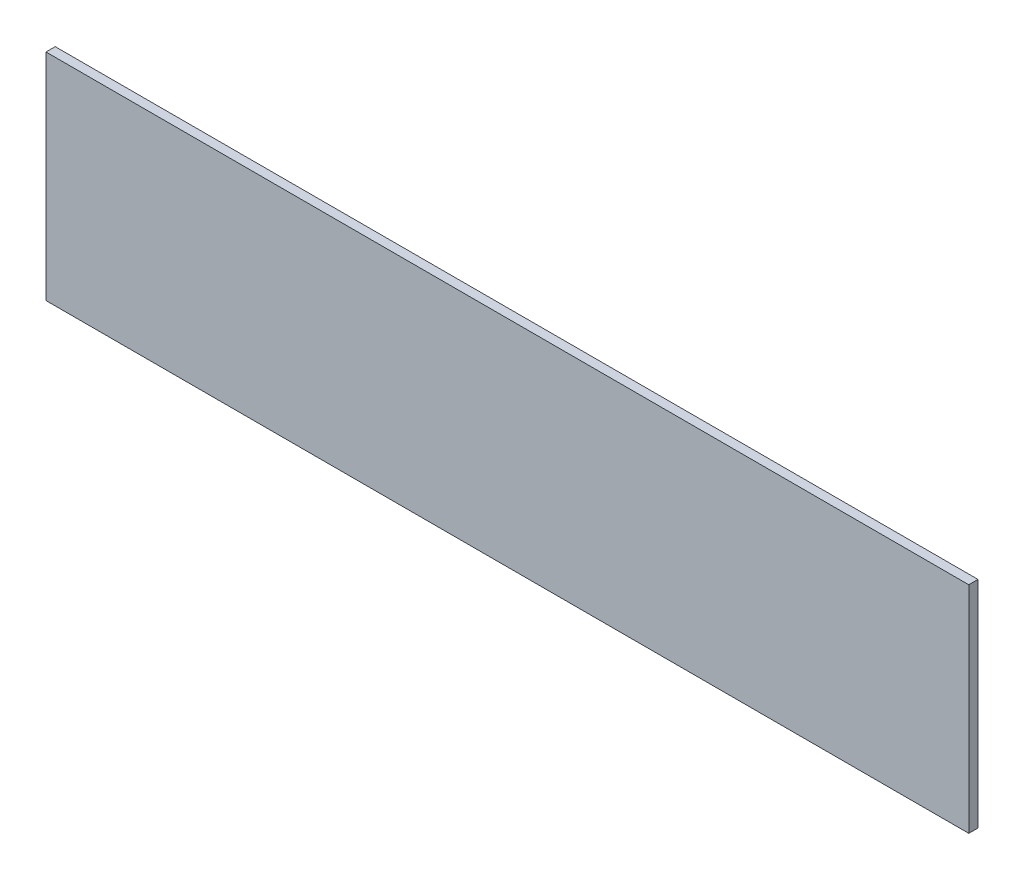
ISO-10303-21;
HEADER;
FILE_DESCRIPTION(('STEP AP214'),'2;1');
FILE_NAME('part.step','',(''),(''),'','','');
FILE_SCHEMA(('AUTOMOTIVE_DESIGN { 1 0 10303 214 1 1 1 1 }'));
ENDSEC;
DATA;
#1=APPLICATION_CONTEXT('core data for automotive mechanical design processes');
#2=APPLICATION_PROTOCOL_DEFINITION('international standard','automotive_design',2000,#1);
#3=PRODUCT_CONTEXT('',#1,'mechanical');
#4=PRODUCT('Part','Part','',(#3));
#5=PRODUCT_RELATED_PRODUCT_CATEGORY('part','',(#4));
#6=PRODUCT_DEFINITION_FORMATION('','',#4);
#7=PRODUCT_DEFINITION_CONTEXT('part definition',#1,'design');
#8=PRODUCT_DEFINITION('design','',#6,#7);
#9=PRODUCT_DEFINITION_SHAPE('','',#8);
#10=(LENGTH_UNIT() NAMED_UNIT(*) SI_UNIT(.MILLI.,.METRE.));
#11=(NAMED_UNIT(*) PLANE_ANGLE_UNIT() SI_UNIT($,.RADIAN.));
#12=(NAMED_UNIT(*) SI_UNIT($,.STERADIAN.) SOLID_ANGLE_UNIT());
#13=UNCERTAINTY_MEASURE_WITH_UNIT(LENGTH_MEASURE(1.E-05),#10,'distance_accuracy_value','');
#14=(GEOMETRIC_REPRESENTATION_CONTEXT(3) GLOBAL_UNCERTAINTY_ASSIGNED_CONTEXT((#13)) GLOBAL_UNIT_ASSIGNED_CONTEXT((#10,
#11,#12)) REPRESENTATION_CONTEXT('',''));
#15=CARTESIAN_POINT('',(0.,0.,0.));
#16=DIRECTION('',(0.,0.,1.));
#17=DIRECTION('',(1.,0.,0.));
#18=AXIS2_PLACEMENT_3D('',#15,#16,#17);
#19=CARTESIAN_POINT('',(150.,-35.,-7.));
#20=DIRECTION('',(-1.,0.,0.));
#21=DIRECTION('',(0.,0.,1.));
#22=AXIS2_PLACEMENT_3D('',#19,#20,#21);
#23=PLANE('',#22);
#24=DIRECTION('',(0.,1.,0.));
#25=VECTOR('',#24,1.);
#26=CARTESIAN_POINT('',(150.,-35.,-10.));
#27=LINE('',#26,#25);
#28=CARTESIAN_POINT('',(150.,-35.,-10.));
#29=VERTEX_POINT('',#28);
#30=CARTESIAN_POINT('',(150.,35.,-10.));
#31=VERTEX_POINT('',#30);
#32=EDGE_CURVE('E100',#29,#31,#27,.T.);
#33=ORIENTED_EDGE('',*,*,#32,.T.);
#34=DIRECTION('',(0.,0.,-1.));
#35=VECTOR('',#34,1.);
#36=CARTESIAN_POINT('',(150.,35.,-7.));
#37=LINE('',#36,#35);
#38=CARTESIAN_POINT('',(150.,35.,-7.));
#39=VERTEX_POINT('',#38);
#40=EDGE_CURVE('E11',#39,#31,#37,.T.);
#41=ORIENTED_EDGE('',*,*,#40,.F.);
#42=DIRECTION('',(0.,1.,0.));
#43=VECTOR('',#42,1.);
#44=CARTESIAN_POINT('',(150.,-35.,-7.));
#45=LINE('',#44,#43);
#46=CARTESIAN_POINT('',(150.,-35.,-7.));
#47=VERTEX_POINT('',#46);
#48=EDGE_CURVE('E88',#47,#39,#45,.T.);
#49=ORIENTED_EDGE('',*,*,#48,.F.);
#50=DIRECTION('',(0.,0.,-1.));
#51=VECTOR('',#50,1.);
#52=CARTESIAN_POINT('',(150.,-35.,-7.));
#53=LINE('',#52,#51);
#54=EDGE_CURVE('E96',#47,#29,#53,.T.);
#55=ORIENTED_EDGE('',*,*,#54,.T.);
#56=EDGE_LOOP('',(#33,#41,#49,#55));
#57=FACE_BOUND('',#56,.T.);
#58=ADVANCED_FACE('F37',(#57),#23,.F.);
#59=CARTESIAN_POINT('',(-150.,35.,-7.));
#60=DIRECTION('',(0.,-1.,0.));
#61=DIRECTION('',(0.,0.,-1.));
#62=AXIS2_PLACEMENT_3D('',#59,#60,#61);
#63=PLANE('',#62);
#64=DIRECTION('',(-1.,0.,0.));
#65=VECTOR('',#64,1.);
#66=CARTESIAN_POINT('',(-150.,35.,-10.));
#67=LINE('',#66,#65);
#68=CARTESIAN_POINT('',(-150.,35.,-10.));
#69=VERTEX_POINT('',#68);
#70=EDGE_CURVE('E92',#31,#69,#67,.T.);
#71=ORIENTED_EDGE('',*,*,#70,.T.);
#72=DIRECTION('',(0.,0.,-1.));
#73=VECTOR('',#72,1.);
#74=CARTESIAN_POINT('',(-150.,35.,-7.));
#75=LINE('',#74,#73);
#76=CARTESIAN_POINT('',(-150.,35.,-7.));
#77=VERTEX_POINT('',#76);
#78=EDGE_CURVE('E45',#77,#69,#75,.T.);
#79=ORIENTED_EDGE('',*,*,#78,.F.);
#80=DIRECTION('',(-1.,0.,0.));
#81=VECTOR('',#80,1.);
#82=CARTESIAN_POINT('',(-150.,35.,-7.));
#83=LINE('',#82,#81);
#84=EDGE_CURVE('E83',#39,#77,#83,.T.);
#85=ORIENTED_EDGE('',*,*,#84,.F.);
#86=ORIENTED_EDGE('',*,*,#40,.T.);
#87=EDGE_LOOP('',(#71,#79,#85,#86));
#88=FACE_BOUND('',#87,.T.);
#89=ADVANCED_FACE('F91',(#88),#63,.F.);
#90=CARTESIAN_POINT('',(-150.,-35.,-7.));
#91=DIRECTION('',(1.,0.,0.));
#92=DIRECTION('',(0.,0.,-1.));
#93=AXIS2_PLACEMENT_3D('',#90,#91,#92);
#94=PLANE('',#93);
#95=DIRECTION('',(0.,-1.,0.));
#96=VECTOR('',#95,1.);
#97=CARTESIAN_POINT('',(-150.,-35.,-10.));
#98=LINE('',#97,#96);
#99=CARTESIAN_POINT('',(-150.,-35.,-10.));
#100=VERTEX_POINT('',#99);
#101=EDGE_CURVE('E70',#69,#100,#98,.T.);
#102=ORIENTED_EDGE('',*,*,#101,.T.);
#103=DIRECTION('',(0.,0.,-1.));
#104=VECTOR('',#103,1.);
#105=CARTESIAN_POINT('',(-150.,-35.,-7.));
#106=LINE('',#105,#104);
#107=CARTESIAN_POINT('',(-150.,-35.,-7.));
#108=VERTEX_POINT('',#107);
#109=EDGE_CURVE('E93',#108,#100,#106,.T.);
#110=ORIENTED_EDGE('',*,*,#109,.F.);
#111=DIRECTION('',(0.,-1.,0.));
#112=VECTOR('',#111,1.);
#113=CARTESIAN_POINT('',(-150.,-35.,-7.));
#114=LINE('',#113,#112);
#115=EDGE_CURVE('E86',#77,#108,#114,.T.);
#116=ORIENTED_EDGE('',*,*,#115,.F.);
#117=ORIENTED_EDGE('',*,*,#78,.T.);
#118=EDGE_LOOP('',(#102,#110,#116,#117));
#119=FACE_BOUND('',#118,.T.);
#120=ADVANCED_FACE('F94',(#119),#94,.F.);
#121=CARTESIAN_POINT('',(-150.,-35.,-7.));
#122=DIRECTION('',(0.,1.,0.));
#123=DIRECTION('',(0.,0.,1.));
#124=AXIS2_PLACEMENT_3D('',#121,#122,#123);
#125=PLANE('',#124);
#126=DIRECTION('',(1.,0.,0.));
#127=VECTOR('',#126,1.);
#128=CARTESIAN_POINT('',(-150.,-35.,-10.));
#129=LINE('',#128,#127);
#130=EDGE_CURVE('E76',#100,#29,#129,.T.);
#131=ORIENTED_EDGE('',*,*,#130,.T.);
#132=ORIENTED_EDGE('',*,*,#54,.F.);
#133=DIRECTION('',(1.,0.,0.));
#134=VECTOR('',#133,1.);
#135=CARTESIAN_POINT('',(-150.,-35.,-7.));
#136=LINE('',#135,#134);
#137=EDGE_CURVE('E53',#108,#47,#136,.T.);
#138=ORIENTED_EDGE('',*,*,#137,.F.);
#139=ORIENTED_EDGE('',*,*,#109,.T.);
#140=EDGE_LOOP('',(#131,#132,#138,#139));
#141=FACE_BOUND('',#140,.T.);
#142=ADVANCED_FACE('F107',(#141),#125,.F.);
#143=CARTESIAN_POINT('',(0.,0.,-7.));
#144=DIRECTION('',(0.,0.,-1.));
#145=DIRECTION('',(-1.,0.,0.));
#146=AXIS2_PLACEMENT_3D('',#143,#144,#145);
#147=PLANE('',#146);
#148=ORIENTED_EDGE('',*,*,#48,.T.);
#149=ORIENTED_EDGE('',*,*,#84,.T.);
#150=ORIENTED_EDGE('',*,*,#115,.T.);
#151=ORIENTED_EDGE('',*,*,#137,.T.);
#152=EDGE_LOOP('',(#148,#149,#150,#151));
#153=FACE_BOUND('',#152,.T.);
#154=ADVANCED_FACE('F84',(#153),#147,.F.);
#155=CARTESIAN_POINT('',(0.,0.,-10.));
#156=DIRECTION('',(0.,0.,-1.));
#157=DIRECTION('',(-1.,0.,0.));
#158=AXIS2_PLACEMENT_3D('',#155,#156,#157);
#159=PLANE('',#158);
#160=ORIENTED_EDGE('',*,*,#32,.F.);
#161=ORIENTED_EDGE('',*,*,#130,.F.);
#162=ORIENTED_EDGE('',*,*,#101,.F.);
#163=ORIENTED_EDGE('',*,*,#70,.F.);
#164=EDGE_LOOP('',(#160,#161,#162,#163));
#165=FACE_BOUND('',#164,.T.);
#166=ADVANCED_FACE('F110',(#165),#159,.T.);
#167=CLOSED_SHELL('',(#58,#89,#120,#142,#154,#166));
#168=MANIFOLD_SOLID_BREP('B2',#167);
#169=ADVANCED_BREP_SHAPE_REPRESENTATION('',(#18,#168),#14);
#170=SHAPE_DEFINITION_REPRESENTATION(#9,#169);
ENDSEC;
END-ISO-10303-21;
